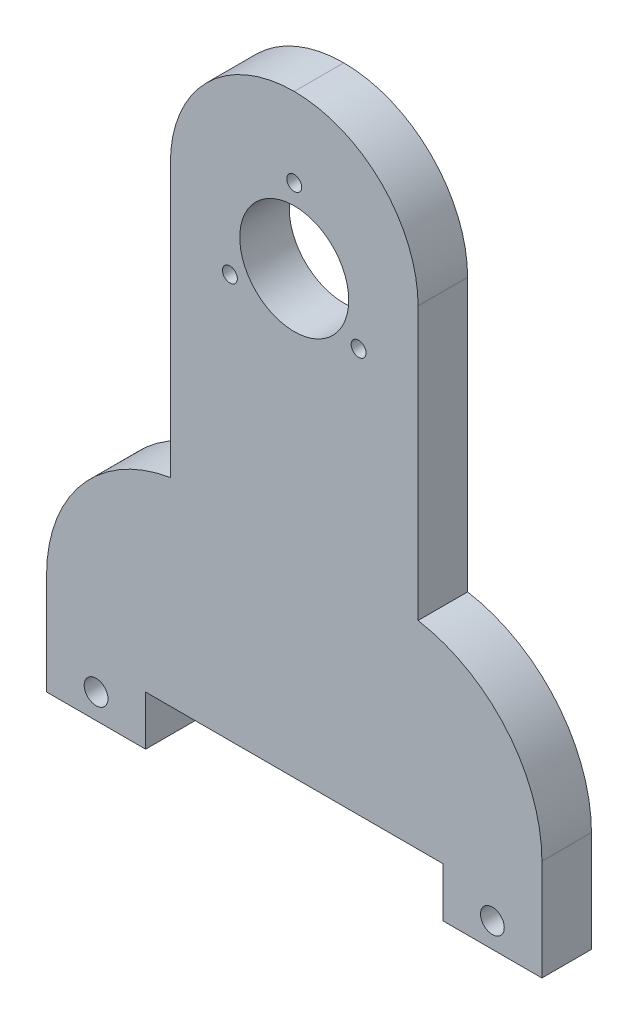
ISO-10303-21;
HEADER;
FILE_DESCRIPTION(('STEP AP214'),'2;1');
FILE_NAME('part.step','',(''),(''),'','','');
FILE_SCHEMA(('AUTOMOTIVE_DESIGN { 1 0 10303 214 1 1 1 1 }'));
ENDSEC;
DATA;
#1=APPLICATION_CONTEXT('core data for automotive mechanical design processes');
#2=APPLICATION_PROTOCOL_DEFINITION('international standard','automotive_design',2000,#1);
#3=PRODUCT_CONTEXT('',#1,'mechanical');
#4=PRODUCT('Part','Part','',(#3));
#5=PRODUCT_RELATED_PRODUCT_CATEGORY('part','',(#4));
#6=PRODUCT_DEFINITION_FORMATION('','',#4);
#7=PRODUCT_DEFINITION_CONTEXT('part definition',#1,'design');
#8=PRODUCT_DEFINITION('design','',#6,#7);
#9=PRODUCT_DEFINITION_SHAPE('','',#8);
#10=(LENGTH_UNIT() NAMED_UNIT(*) SI_UNIT(.MILLI.,.METRE.));
#11=(NAMED_UNIT(*) PLANE_ANGLE_UNIT() SI_UNIT($,.RADIAN.));
#12=(NAMED_UNIT(*) SI_UNIT($,.STERADIAN.) SOLID_ANGLE_UNIT());
#13=UNCERTAINTY_MEASURE_WITH_UNIT(LENGTH_MEASURE(1.E-05),#10,'distance_accuracy_value','');
#14=(GEOMETRIC_REPRESENTATION_CONTEXT(3) GLOBAL_UNCERTAINTY_ASSIGNED_CONTEXT((#13)) GLOBAL_UNIT_ASSIGNED_CONTEXT((#10,
#11,#12)) REPRESENTATION_CONTEXT('',''));
#15=CARTESIAN_POINT('',(0.,0.,0.));
#16=DIRECTION('',(0.,0.,1.));
#17=DIRECTION('',(1.,0.,0.));
#18=AXIS2_PLACEMENT_3D('',#15,#16,#17);
#19=CARTESIAN_POINT('',(30.,-49.,-15.));
#20=DIRECTION('',(0.,-1.,0.));
#21=DIRECTION('',(0.,0.,-1.));
#22=AXIS2_PLACEMENT_3D('',#19,#20,#21);
#23=PLANE('',#22);
#24=CARTESIAN_POINT('',(13.5,-49.,-7.5));
#25=DIRECTION('',(0.,1.,0.));
#26=DIRECTION('',(0.,0.,1.));
#27=AXIS2_PLACEMENT_3D('',#24,#25,#26);
#28=CIRCLE('',#27,2.);
#29=CARTESIAN_POINT('',(13.5,-49.,-5.5));
#30=VERTEX_POINT('',#29);
#31=EDGE_CURVE('E221',#30,#30,#28,.T.);
#32=ORIENTED_EDGE('',*,*,#31,.F.);
#33=EDGE_LOOP('',(#32));
#34=FACE_BOUND('',#33,.T.);
#35=DIRECTION('',(0.,0.,1.));
#36=VECTOR('',#35,1.);
#37=CARTESIAN_POINT('',(24.,-49.,-15.));
#38=LINE('',#37,#36);
#39=CARTESIAN_POINT('',(24.,-49.,-15.));
#40=VERTEX_POINT('',#39);
#41=CARTESIAN_POINT('',(24.,-49.,0.));
#42=VERTEX_POINT('',#41);
#43=EDGE_CURVE('E209',#40,#42,#38,.T.);
#44=ORIENTED_EDGE('',*,*,#43,.F.);
#45=DIRECTION('',(1.,0.,0.));
#46=VECTOR('',#45,1.);
#47=CARTESIAN_POINT('',(30.,-49.,-15.));
#48=LINE('',#47,#46);
#49=CARTESIAN_POINT('',(3.,-49.,-15.));
#50=VERTEX_POINT('',#49);
#51=EDGE_CURVE('E274',#50,#40,#48,.T.);
#52=ORIENTED_EDGE('',*,*,#51,.F.);
#53=DIRECTION('',(0.,0.,1.));
#54=VECTOR('',#53,1.);
#55=CARTESIAN_POINT('',(3.,-49.,-15.));
#56=LINE('',#55,#54);
#57=CARTESIAN_POINT('',(3.,-49.,0.));
#58=VERTEX_POINT('',#57);
#59=EDGE_CURVE('E253',#50,#58,#56,.T.);
#60=ORIENTED_EDGE('',*,*,#59,.T.);
#61=DIRECTION('',(1.,0.,0.));
#62=VECTOR('',#61,1.);
#63=CARTESIAN_POINT('',(30.,-49.,0.));
#64=LINE('',#63,#62);
#65=EDGE_CURVE('E282',#58,#42,#64,.T.);
#66=ORIENTED_EDGE('',*,*,#65,.T.);
#67=EDGE_LOOP('',(#44,#52,#60,#66));
#68=FACE_BOUND('',#67,.T.);
#69=ADVANCED_FACE('F37',(#34,#68),#23,.F.);
#70=CARTESIAN_POINT('',(-13.5,-49.,-7.5));
#71=DIRECTION('',(0.,1.,0.));
#72=DIRECTION('',(0.,0.,1.));
#73=AXIS2_PLACEMENT_3D('',#70,#71,#72);
#74=CIRCLE('',#73,2.);
#75=CARTESIAN_POINT('',(-13.5,-49.,-5.5));
#76=VERTEX_POINT('',#75);
#77=EDGE_CURVE('E370',#76,#76,#74,.T.);
#78=ORIENTED_EDGE('',*,*,#77,.F.);
#79=EDGE_LOOP('',(#78));
#80=FACE_BOUND('',#79,.T.);
#81=DIRECTION('',(0.,0.,-1.));
#82=VECTOR('',#81,1.);
#83=CARTESIAN_POINT('',(-24.,-49.,-15.));
#84=LINE('',#83,#82);
#85=CARTESIAN_POINT('',(-24.,-49.,0.));
#86=VERTEX_POINT('',#85);
#87=CARTESIAN_POINT('',(-24.,-49.,-15.));
#88=VERTEX_POINT('',#87);
#89=EDGE_CURVE('E235',#86,#88,#84,.T.);
#90=ORIENTED_EDGE('',*,*,#89,.F.);
#91=CARTESIAN_POINT('',(-3.,-49.,0.));
#92=VERTEX_POINT('',#91);
#93=EDGE_CURVE('E269',#86,#92,#64,.T.);
#94=ORIENTED_EDGE('',*,*,#93,.T.);
#95=DIRECTION('',(0.,0.,1.));
#96=VECTOR('',#95,1.);
#97=CARTESIAN_POINT('',(-3.,-49.,-15.));
#98=LINE('',#97,#96);
#99=CARTESIAN_POINT('',(-3.,-49.,-15.));
#100=VERTEX_POINT('',#99);
#101=EDGE_CURVE('E245',#100,#92,#98,.T.);
#102=ORIENTED_EDGE('',*,*,#101,.F.);
#103=EDGE_CURVE('E278',#88,#100,#48,.T.);
#104=ORIENTED_EDGE('',*,*,#103,.F.);
#105=EDGE_LOOP('',(#90,#94,#102,#104));
#106=FACE_BOUND('',#105,.T.);
#107=ADVANCED_FACE('F416',(#80,#106),#23,.F.);
#108=CARTESIAN_POINT('',(-50.,-65.,10.));
#109=DIRECTION('',(0.,1.,0.));
#110=DIRECTION('',(0.,0.,1.));
#111=AXIS2_PLACEMENT_3D('',#108,#109,#110);
#112=PLANE('',#111);
#113=DIRECTION('',(1.,0.,0.));
#114=VECTOR('',#113,1.);
#115=CARTESIAN_POINT('',(-50.,-65.,0.));
#116=LINE('',#115,#114);
#117=CARTESIAN_POINT('',(-50.,-65.,0.));
#118=VERTEX_POINT('',#117);
#119=CARTESIAN_POINT('',(-30.,-65.,0.));
#120=VERTEX_POINT('',#119);
#121=EDGE_CURVE('E319',#118,#120,#116,.T.);
#122=ORIENTED_EDGE('',*,*,#121,.T.);
#123=DIRECTION('',(0.,0.,1.));
#124=VECTOR('',#123,1.);
#125=CARTESIAN_POINT('',(-30.,-65.,-45.));
#126=LINE('',#125,#124);
#127=CARTESIAN_POINT('',(-30.,-65.,10.));
#128=VERTEX_POINT('',#127);
#129=EDGE_CURVE('E297',#120,#128,#126,.T.);
#130=ORIENTED_EDGE('',*,*,#129,.T.);
#131=DIRECTION('',(1.,0.,0.));
#132=VECTOR('',#131,1.);
#133=CARTESIAN_POINT('',(-50.,-65.,10.));
#134=LINE('',#133,#132);
#135=CARTESIAN_POINT('',(-50.,-65.,10.));
#136=VERTEX_POINT('',#135);
#137=EDGE_CURVE('E322',#136,#128,#134,.T.);
#138=ORIENTED_EDGE('',*,*,#137,.F.);
#139=DIRECTION('',(0.,0.,-1.));
#140=VECTOR('',#139,1.);
#141=CARTESIAN_POINT('',(-50.,-65.,10.));
#142=LINE('',#141,#140);
#143=EDGE_CURVE('E335',#136,#118,#142,.T.);
#144=ORIENTED_EDGE('',*,*,#143,.T.);
#145=EDGE_LOOP('',(#122,#130,#138,#144));
#146=FACE_BOUND('',#145,.T.);
#147=ADVANCED_FACE('F519',(#146),#112,.F.);
#148=CARTESIAN_POINT('',(50.,-65.,10.));
#149=DIRECTION('',(-1.,0.,0.));
#150=DIRECTION('',(0.,0.,1.));
#151=AXIS2_PLACEMENT_3D('',#148,#149,#150);
#152=PLANE('',#151);
#153=DIRECTION('',(0.,1.,0.));
#154=VECTOR('',#153,1.);
#155=CARTESIAN_POINT('',(50.,-65.,0.));
#156=LINE('',#155,#154);
#157=CARTESIAN_POINT('',(50.,-65.,0.));
#158=VERTEX_POINT('',#157);
#159=CARTESIAN_POINT('',(50.,-44.5803989154981,0.));
#160=VERTEX_POINT('',#159);
#161=EDGE_CURVE('E301',#158,#160,#156,.T.);
#162=ORIENTED_EDGE('',*,*,#161,.T.);
#163=DIRECTION('',(0.,0.,-1.));
#164=VECTOR('',#163,1.);
#165=CARTESIAN_POINT('',(50.,-44.5803989154981,10.));
#166=LINE('',#165,#164);
#167=CARTESIAN_POINT('',(50.,-44.5803989154981,10.));
#168=VERTEX_POINT('',#167);
#169=EDGE_CURVE('E347',#160,#168,#166,.F.);
#170=ORIENTED_EDGE('',*,*,#169,.T.);
#171=DIRECTION('',(0.,1.,0.));
#172=VECTOR('',#171,1.);
#173=CARTESIAN_POINT('',(50.,-65.,10.));
#174=LINE('',#173,#172);
#175=CARTESIAN_POINT('',(50.,-65.,10.));
#176=VERTEX_POINT('',#175);
#177=EDGE_CURVE('E315',#176,#168,#174,.T.);
#178=ORIENTED_EDGE('',*,*,#177,.F.);
#179=DIRECTION('',(0.,0.,-1.));
#180=VECTOR('',#179,1.);
#181=CARTESIAN_POINT('',(50.,-65.,10.));
#182=LINE('',#181,#180);
#183=EDGE_CURVE('E325',#176,#158,#182,.T.);
#184=ORIENTED_EDGE('',*,*,#183,.T.);
#185=EDGE_LOOP('',(#162,#170,#178,#184));
#186=FACE_BOUND('',#185,.T.);
#187=ADVANCED_FACE('F522',(#186),#152,.F.);
#188=CARTESIAN_POINT('',(-50.,-65.,10.));
#189=DIRECTION('',(1.,0.,0.));
#190=DIRECTION('',(0.,0.,-1.));
#191=AXIS2_PLACEMENT_3D('',#188,#189,#190);
#192=PLANE('',#191);
#193=DIRECTION('',(0.,-1.,0.));
#194=VECTOR('',#193,1.);
#195=CARTESIAN_POINT('',(-50.,-65.,10.));
#196=LINE('',#195,#194);
#197=CARTESIAN_POINT('',(-50.,-44.5803989154981,10.));
#198=VERTEX_POINT('',#197);
#199=EDGE_CURVE('E318',#198,#136,#196,.T.);
#200=ORIENTED_EDGE('',*,*,#199,.F.);
#201=DIRECTION('',(0.,0.,1.));
#202=VECTOR('',#201,1.);
#203=CARTESIAN_POINT('',(-50.,-44.5803989154981,10.));
#204=LINE('',#203,#202);
#205=CARTESIAN_POINT('',(-50.,-44.5803989154981,0.));
#206=VERTEX_POINT('',#205);
#207=EDGE_CURVE('E361',#198,#206,#204,.F.);
#208=ORIENTED_EDGE('',*,*,#207,.T.);
#209=DIRECTION('',(0.,-1.,0.));
#210=VECTOR('',#209,1.);
#211=CARTESIAN_POINT('',(-50.,-65.,0.));
#212=LINE('',#211,#210);
#213=EDGE_CURVE('E328',#206,#118,#212,.T.);
#214=ORIENTED_EDGE('',*,*,#213,.T.);
#215=ORIENTED_EDGE('',*,*,#143,.F.);
#216=EDGE_LOOP('',(#200,#208,#214,#215));
#217=FACE_BOUND('',#216,.T.);
#218=ADVANCED_FACE('F517',(#217),#192,.F.);
#219=CARTESIAN_POINT('',(30.,-65.,10.));
#220=VERTEX_POINT('',#219);
#221=EDGE_CURVE('E321',#220,#176,#134,.T.);
#222=ORIENTED_EDGE('',*,*,#221,.F.);
#223=DIRECTION('',(0.,0.,1.));
#224=VECTOR('',#223,1.);
#225=CARTESIAN_POINT('',(30.,-65.,-45.));
#226=LINE('',#225,#224);
#227=CARTESIAN_POINT('',(30.,-65.,0.));
#228=VERTEX_POINT('',#227);
#229=EDGE_CURVE('E304',#228,#220,#226,.T.);
#230=ORIENTED_EDGE('',*,*,#229,.F.);
#231=EDGE_CURVE('E330',#228,#158,#116,.T.);
#232=ORIENTED_EDGE('',*,*,#231,.T.);
#233=ORIENTED_EDGE('',*,*,#183,.F.);
#234=EDGE_LOOP('',(#222,#230,#232,#233));
#235=FACE_BOUND('',#234,.T.);
#236=ADVANCED_FACE('F510',(#235),#112,.F.);
#237=CARTESIAN_POINT('',(0.,0.,10.));
#238=DIRECTION('',(0.,0.,-1.));
#239=DIRECTION('',(-1.,0.,0.));
#240=AXIS2_PLACEMENT_3D('',#237,#238,#239);
#241=PLANE('',#240);
#242=CARTESIAN_POINT('',(0.,49.,10.));
#243=DIRECTION('',(0.,0.,1.));
#244=DIRECTION('',(1.,0.,0.));
#245=AXIS2_PLACEMENT_3D('',#242,#243,#244);
#246=CIRCLE('',#245,1.5);
#247=CARTESIAN_POINT('',(1.5,49.,10.));
#248=VERTEX_POINT('',#247);
#249=EDGE_CURVE('E391',#248,#248,#246,.T.);
#250=ORIENTED_EDGE('',*,*,#249,.F.);
#251=EDGE_LOOP('',(#250));
#252=FACE_BOUND('',#251,.T.);
#253=CARTESIAN_POINT('',(12.9903810567672,26.5000000000003,10.));
#254=DIRECTION('',(0.,0.,1.));
#255=DIRECTION('',(1.,0.,0.));
#256=AXIS2_PLACEMENT_3D('',#253,#254,#255);
#257=CIRCLE('',#256,1.5);
#258=CARTESIAN_POINT('',(14.4903810567672,26.5000000000003,10.));
#259=VERTEX_POINT('',#258);
#260=EDGE_CURVE('E871',#259,#259,#257,.T.);
#261=ORIENTED_EDGE('',*,*,#260,.F.);
#262=EDGE_LOOP('',(#261));
#263=FACE_BOUND('',#262,.T.);
#264=CARTESIAN_POINT('',(-12.990381056766,26.4999999999997,10.));
#265=DIRECTION('',(0.,0.,1.));
#266=DIRECTION('',(1.,0.,0.));
#267=AXIS2_PLACEMENT_3D('',#264,#265,#266);
#268=CIRCLE('',#267,1.5);
#269=CARTESIAN_POINT('',(-11.490381056766,26.4999999999997,10.));
#270=VERTEX_POINT('',#269);
#271=EDGE_CURVE('E403',#270,#270,#268,.T.);
#272=ORIENTED_EDGE('',*,*,#271,.F.);
#273=EDGE_LOOP('',(#272));
#274=FACE_BOUND('',#273,.T.);
#275=CARTESIAN_POINT('',(0.,34.,10.));
#276=DIRECTION('',(0.,0.,1.));
#277=DIRECTION('',(1.,0.,0.));
#278=AXIS2_PLACEMENT_3D('',#275,#276,#277);
#279=CIRCLE('',#278,11.);
#280=CARTESIAN_POINT('',(11.,34.,10.));
#281=VERTEX_POINT('',#280);
#282=EDGE_CURVE('E387',#281,#281,#279,.T.);
#283=ORIENTED_EDGE('',*,*,#282,.F.);
#284=EDGE_LOOP('',(#283));
#285=FACE_BOUND('',#284,.T.);
#286=DIRECTION('',(0.,-1.,0.));
#287=VECTOR('',#286,1.);
#288=CARTESIAN_POINT('',(25.,65.,10.));
#289=LINE('',#288,#287);
#290=CARTESIAN_POINT('',(25.,40.,10.));
#291=VERTEX_POINT('',#290);
#292=CARTESIAN_POINT('',(25.,-15.,10.));
#293=VERTEX_POINT('',#292);
#294=EDGE_CURVE('E310',#291,#293,#289,.T.);
#295=ORIENTED_EDGE('',*,*,#294,.F.);
#296=CARTESIAN_POINT('',(0.,40.,10.));
#297=DIRECTION('',(0.,0.,-1.));
#298=DIRECTION('',(-1.,0.,0.));
#299=AXIS2_PLACEMENT_3D('',#296,#297,#298);
#300=CIRCLE('',#299,25.);
#301=CARTESIAN_POINT('',(0.,65.,10.));
#302=VERTEX_POINT('',#301);
#303=EDGE_CURVE('E377',#291,#302,#300,.F.);
#304=ORIENTED_EDGE('',*,*,#303,.T.);
#305=CARTESIAN_POINT('',(0.,40.,10.));
#306=DIRECTION('',(0.,0.,-1.));
#307=DIRECTION('',(-1.,0.,0.));
#308=AXIS2_PLACEMENT_3D('',#305,#306,#307);
#309=CIRCLE('',#308,25.);
#310=CARTESIAN_POINT('',(-25.,40.,10.));
#311=VERTEX_POINT('',#310);
#312=EDGE_CURVE('E375',#302,#311,#309,.F.);
#313=ORIENTED_EDGE('',*,*,#312,.T.);
#314=DIRECTION('',(0.,1.,0.));
#315=VECTOR('',#314,1.);
#316=CARTESIAN_POINT('',(-25.,65.,10.));
#317=LINE('',#316,#315);
#318=CARTESIAN_POINT('',(-25.,-15.,10.));
#319=VERTEX_POINT('',#318);
#320=EDGE_CURVE('E292',#319,#311,#317,.T.);
#321=ORIENTED_EDGE('',*,*,#320,.F.);
#322=CARTESIAN_POINT('',(-20.,-44.5803989154981,10.));
#323=DIRECTION('',(0.,0.,-1.));
#324=DIRECTION('',(-1.,0.,0.));
#325=AXIS2_PLACEMENT_3D('',#322,#323,#324);
#326=CIRCLE('',#325,30.);
#327=EDGE_CURVE('E359',#319,#198,#326,.F.);
#328=ORIENTED_EDGE('',*,*,#327,.T.);
#329=ORIENTED_EDGE('',*,*,#199,.T.);
#330=ORIENTED_EDGE('',*,*,#137,.T.);
#331=DIRECTION('',(0.,-1.,0.));
#332=VECTOR('',#331,1.);
#333=CARTESIAN_POINT('',(-30.,-65.,10.));
#334=LINE('',#333,#332);
#335=CARTESIAN_POINT('',(-30.,-55.,10.));
#336=VERTEX_POINT('',#335);
#337=EDGE_CURVE('E289',#336,#128,#334,.T.);
#338=ORIENTED_EDGE('',*,*,#337,.F.);
#339=DIRECTION('',(-1.,0.,0.));
#340=VECTOR('',#339,1.);
#341=CARTESIAN_POINT('',(-30.,-55.,10.));
#342=LINE('',#341,#340);
#343=CARTESIAN_POINT('',(30.,-55.,10.));
#344=VERTEX_POINT('',#343);
#345=EDGE_CURVE('E295',#344,#336,#342,.T.);
#346=ORIENTED_EDGE('',*,*,#345,.F.);
#347=DIRECTION('',(0.,1.,0.));
#348=VECTOR('',#347,1.);
#349=CARTESIAN_POINT('',(30.,-65.,10.));
#350=LINE('',#349,#348);
#351=EDGE_CURVE('E291',#220,#344,#350,.T.);
#352=ORIENTED_EDGE('',*,*,#351,.F.);
#353=ORIENTED_EDGE('',*,*,#221,.T.);
#354=ORIENTED_EDGE('',*,*,#177,.T.);
#355=CARTESIAN_POINT('',(20.,-44.5803989154981,10.));
#356=DIRECTION('',(0.,0.,-1.));
#357=DIRECTION('',(-1.,0.,0.));
#358=AXIS2_PLACEMENT_3D('',#355,#356,#357);
#359=CIRCLE('',#358,30.);
#360=EDGE_CURVE('E354',#168,#293,#359,.F.);
#361=ORIENTED_EDGE('',*,*,#360,.T.);
#362=EDGE_LOOP('',(#295,#304,#313,#321,#328,#329,#330,#338,#346,#352,#353,#354,#361));
#363=FACE_BOUND('',#362,.T.);
#364=CARTESIAN_POINT('',(-40.,-60.,10.));
#365=DIRECTION('',(0.,0.,1.));
#366=DIRECTION('',(1.,0.,0.));
#367=AXIS2_PLACEMENT_3D('',#364,#365,#366);
#368=CIRCLE('',#367,2.4);
#369=CARTESIAN_POINT('',(-37.6,-60.,10.));
#370=VERTEX_POINT('',#369);
#371=EDGE_CURVE('E261',#370,#370,#368,.T.);
#372=ORIENTED_EDGE('',*,*,#371,.F.);
#373=EDGE_LOOP('',(#372));
#374=FACE_BOUND('',#373,.T.);
#375=CARTESIAN_POINT('',(40.,-60.,10.));
#376=DIRECTION('',(0.,0.,1.));
#377=DIRECTION('',(1.,0.,0.));
#378=AXIS2_PLACEMENT_3D('',#375,#376,#377);
#379=CIRCLE('',#378,2.4);
#380=CARTESIAN_POINT('',(42.4,-60.,10.));
#381=VERTEX_POINT('',#380);
#382=EDGE_CURVE('E260',#381,#381,#379,.T.);
#383=ORIENTED_EDGE('',*,*,#382,.F.);
#384=EDGE_LOOP('',(#383));
#385=FACE_BOUND('',#384,.T.);
#386=ADVANCED_FACE('F507',(#252,#263,#274,#285,#363,#374,#385),#241,.F.);
#387=CARTESIAN_POINT('',(0.,0.,0.));
#388=DIRECTION('',(0.,0.,-1.));
#389=DIRECTION('',(-1.,0.,0.));
#390=AXIS2_PLACEMENT_3D('',#387,#388,#389);
#391=PLANE('',#390);
#392=CARTESIAN_POINT('',(0.,49.,0.));
#393=DIRECTION('',(0.,0.,-1.));
#394=DIRECTION('',(-1.,0.,0.));
#395=AXIS2_PLACEMENT_3D('',#392,#393,#394);
#396=CIRCLE('',#395,1.5);
#397=CARTESIAN_POINT('',(-1.5,49.,0.));
#398=VERTEX_POINT('',#397);
#399=EDGE_CURVE('E41',#398,#398,#396,.T.);
#400=ORIENTED_EDGE('',*,*,#399,.F.);
#401=EDGE_LOOP('',(#400));
#402=FACE_BOUND('',#401,.T.);
#403=CARTESIAN_POINT('',(12.9903810567672,26.5000000000003,0.));
#404=DIRECTION('',(0.,0.,-1.));
#405=DIRECTION('',(-1.,0.,0.));
#406=AXIS2_PLACEMENT_3D('',#403,#404,#405);
#407=CIRCLE('',#406,1.5);
#408=CARTESIAN_POINT('',(11.4903810567672,26.5000000000003,0.));
#409=VERTEX_POINT('',#408);
#410=EDGE_CURVE('E390',#409,#409,#407,.T.);
#411=ORIENTED_EDGE('',*,*,#410,.F.);
#412=EDGE_LOOP('',(#411));
#413=FACE_BOUND('',#412,.T.);
#414=CARTESIAN_POINT('',(-12.990381056766,26.4999999999997,0.));
#415=DIRECTION('',(0.,0.,-1.));
#416=DIRECTION('',(-1.,0.,0.));
#417=AXIS2_PLACEMENT_3D('',#414,#415,#416);
#418=CIRCLE('',#417,1.5);
#419=CARTESIAN_POINT('',(-14.490381056766,26.4999999999997,0.));
#420=VERTEX_POINT('',#419);
#421=EDGE_CURVE('E388',#420,#420,#418,.T.);
#422=ORIENTED_EDGE('',*,*,#421,.F.);
#423=EDGE_LOOP('',(#422));
#424=FACE_BOUND('',#423,.T.);
#425=CARTESIAN_POINT('',(0.,34.,0.));
#426=DIRECTION('',(0.,0.,-1.));
#427=DIRECTION('',(-1.,0.,0.));
#428=AXIS2_PLACEMENT_3D('',#425,#426,#427);
#429=CIRCLE('',#428,11.);
#430=CARTESIAN_POINT('',(-11.,34.,0.));
#431=VERTEX_POINT('',#430);
#432=EDGE_CURVE('E384',#431,#431,#429,.T.);
#433=ORIENTED_EDGE('',*,*,#432,.F.);
#434=EDGE_LOOP('',(#433));
#435=FACE_BOUND('',#434,.T.);
#436=CARTESIAN_POINT('',(0.,40.,0.));
#437=DIRECTION('',(0.,0.,-1.));
#438=DIRECTION('',(-1.,0.,0.));
#439=AXIS2_PLACEMENT_3D('',#436,#437,#438);
#440=CIRCLE('',#439,25.);
#441=CARTESIAN_POINT('',(-25.,40.,0.));
#442=VERTEX_POINT('',#441);
#443=CARTESIAN_POINT('',(0.,65.,0.));
#444=VERTEX_POINT('',#443);
#445=EDGE_CURVE('E54',#442,#444,#440,.T.);
#446=ORIENTED_EDGE('',*,*,#445,.T.);
#447=CARTESIAN_POINT('',(0.,40.,0.));
#448=DIRECTION('',(0.,0.,-1.));
#449=DIRECTION('',(-1.,0.,0.));
#450=AXIS2_PLACEMENT_3D('',#447,#448,#449);
#451=CIRCLE('',#450,25.);
#452=CARTESIAN_POINT('',(25.,40.,0.));
#453=VERTEX_POINT('',#452);
#454=EDGE_CURVE('E46',#444,#453,#451,.T.);
#455=ORIENTED_EDGE('',*,*,#454,.T.);
#456=DIRECTION('',(0.,1.,0.));
#457=VECTOR('',#456,1.);
#458=CARTESIAN_POINT('',(25.,0.,0.));
#459=LINE('',#458,#457);
#460=CARTESIAN_POINT('',(25.,-15.,0.));
#461=VERTEX_POINT('',#460);
#462=EDGE_CURVE('E338',#461,#453,#459,.T.);
#463=ORIENTED_EDGE('',*,*,#462,.F.);
#464=CARTESIAN_POINT('',(20.,-44.5803989154981,0.));
#465=DIRECTION('',(0.,0.,-1.));
#466=DIRECTION('',(-1.,0.,0.));
#467=AXIS2_PLACEMENT_3D('',#464,#465,#466);
#468=CIRCLE('',#467,30.);
#469=EDGE_CURVE('E357',#461,#160,#468,.T.);
#470=ORIENTED_EDGE('',*,*,#469,.T.);
#471=ORIENTED_EDGE('',*,*,#161,.F.);
#472=ORIENTED_EDGE('',*,*,#231,.F.);
#473=DIRECTION('',(0.,-1.,0.));
#474=VECTOR('',#473,1.);
#475=CARTESIAN_POINT('',(30.,0.,0.));
#476=LINE('',#475,#474);
#477=CARTESIAN_POINT('',(30.,-55.,0.));
#478=VERTEX_POINT('',#477);
#479=EDGE_CURVE('E194',#478,#228,#476,.T.);
#480=ORIENTED_EDGE('',*,*,#479,.F.);
#481=DIRECTION('',(0.,-1.,0.));
#482=VECTOR('',#481,1.);
#483=CARTESIAN_POINT('',(30.,-55.,0.));
#484=LINE('',#483,#482);
#485=CARTESIAN_POINT('',(30.,-25.8796097382969,0.));
#486=VERTEX_POINT('',#485);
#487=EDGE_CURVE('E187',#486,#478,#484,.T.);
#488=ORIENTED_EDGE('',*,*,#487,.F.);
#489=DIRECTION('',(1.,0.,0.));
#490=VECTOR('',#489,1.);
#491=CARTESIAN_POINT('',(0.,-25.8796097382969,0.));
#492=LINE('',#491,#490);
#493=CARTESIAN_POINT('',(24.,-25.8796097382969,0.));
#494=VERTEX_POINT('',#493);
#495=EDGE_CURVE('E192',#494,#486,#492,.T.);
#496=ORIENTED_EDGE('',*,*,#495,.F.);
#497=DIRECTION('',(0.,-1.,0.));
#498=VECTOR('',#497,1.);
#499=CARTESIAN_POINT('',(24.,0.,0.));
#500=LINE('',#499,#498);
#501=EDGE_CURVE('E225',#494,#42,#500,.T.);
#502=ORIENTED_EDGE('',*,*,#501,.T.);
#503=ORIENTED_EDGE('',*,*,#65,.F.);
#504=DIRECTION('',(0.,-1.,0.));
#505=VECTOR('',#504,1.);
#506=CARTESIAN_POINT('',(3.,0.,0.));
#507=LINE('',#506,#505);
#508=CARTESIAN_POINT('',(3.,0.,0.));
#509=VERTEX_POINT('',#508);
#510=EDGE_CURVE('E256',#509,#58,#507,.T.);
#511=ORIENTED_EDGE('',*,*,#510,.F.);
#512=DIRECTION('',(1.,0.,0.));
#513=VECTOR('',#512,1.);
#514=CARTESIAN_POINT('',(0.,0.,0.));
#515=LINE('',#514,#513);
#516=CARTESIAN_POINT('',(-3.,0.,0.));
#517=VERTEX_POINT('',#516);
#518=EDGE_CURVE('E258',#517,#509,#515,.T.);
#519=ORIENTED_EDGE('',*,*,#518,.F.);
#520=DIRECTION('',(0.,-1.,0.));
#521=VECTOR('',#520,1.);
#522=CARTESIAN_POINT('',(-3.,0.,0.));
#523=LINE('',#522,#521);
#524=EDGE_CURVE('E250',#517,#92,#523,.T.);
#525=ORIENTED_EDGE('',*,*,#524,.T.);
#526=ORIENTED_EDGE('',*,*,#93,.F.);
#527=DIRECTION('',(0.,1.,0.));
#528=VECTOR('',#527,1.);
#529=CARTESIAN_POINT('',(-24.,0.,0.));
#530=LINE('',#529,#528);
#531=CARTESIAN_POINT('',(-24.,-25.8796097382969,0.));
#532=VERTEX_POINT('',#531);
#533=EDGE_CURVE('E238',#86,#532,#530,.T.);
#534=ORIENTED_EDGE('',*,*,#533,.T.);
#535=DIRECTION('',(-1.,0.,0.));
#536=VECTOR('',#535,1.);
#537=CARTESIAN_POINT('',(0.,-25.8796097382969,0.));
#538=LINE('',#537,#536);
#539=CARTESIAN_POINT('',(-30.,-25.8796097382969,0.));
#540=VERTEX_POINT('',#539);
#541=EDGE_CURVE('E231',#540,#532,#538,.F.);
#542=ORIENTED_EDGE('',*,*,#541,.F.);
#543=DIRECTION('',(0.,1.,0.));
#544=VECTOR('',#543,1.);
#545=CARTESIAN_POINT('',(-30.,-55.,0.));
#546=LINE('',#545,#544);
#547=CARTESIAN_POINT('',(-30.,-55.,0.));
#548=VERTEX_POINT('',#547);
#549=EDGE_CURVE('E199',#548,#540,#546,.T.);
#550=ORIENTED_EDGE('',*,*,#549,.F.);
#551=DIRECTION('',(0.,1.,0.));
#552=VECTOR('',#551,1.);
#553=CARTESIAN_POINT('',(-30.,0.,0.));
#554=LINE('',#553,#552);
#555=EDGE_CURVE('E344',#120,#548,#554,.T.);
#556=ORIENTED_EDGE('',*,*,#555,.F.);
#557=ORIENTED_EDGE('',*,*,#121,.F.);
#558=ORIENTED_EDGE('',*,*,#213,.F.);
#559=CARTESIAN_POINT('',(-20.,-44.5803989154981,0.));
#560=DIRECTION('',(0.,0.,-1.));
#561=DIRECTION('',(-1.,0.,0.));
#562=AXIS2_PLACEMENT_3D('',#559,#560,#561);
#563=CIRCLE('',#562,30.);
#564=CARTESIAN_POINT('',(-25.,-15.,0.));
#565=VERTEX_POINT('',#564);
#566=EDGE_CURVE('E363',#206,#565,#563,.T.);
#567=ORIENTED_EDGE('',*,*,#566,.T.);
#568=DIRECTION('',(0.,-1.,0.));
#569=VECTOR('',#568,1.);
#570=CARTESIAN_POINT('',(-25.,0.,0.));
#571=LINE('',#570,#569);
#572=EDGE_CURVE('E341',#442,#565,#571,.T.);
#573=ORIENTED_EDGE('',*,*,#572,.F.);
#574=EDGE_LOOP('',(#446,#455,#463,#470,#471,#472,#480,#488,#496,#502,#503,#511,#519,#525,#526,
#534,#542,#550,#556,#557,#558,#567,#573));
#575=FACE_BOUND('',#574,.T.);
#576=CARTESIAN_POINT('',(-40.,-60.,0.));
#577=DIRECTION('',(0.,0.,-1.));
#578=DIRECTION('',(-1.,0.,0.));
#579=AXIS2_PLACEMENT_3D('',#576,#577,#578);
#580=CIRCLE('',#579,2.4);
#581=CARTESIAN_POINT('',(-42.4,-60.,0.));
#582=VERTEX_POINT('',#581);
#583=EDGE_CURVE('E200',#582,#582,#580,.T.);
#584=ORIENTED_EDGE('',*,*,#583,.F.);
#585=EDGE_LOOP('',(#584));
#586=FACE_BOUND('',#585,.T.);
#587=CARTESIAN_POINT('',(40.,-60.,0.));
#588=DIRECTION('',(0.,0.,-1.));
#589=DIRECTION('',(-1.,0.,0.));
#590=AXIS2_PLACEMENT_3D('',#587,#588,#589);
#591=CIRCLE('',#590,2.4);
#592=CARTESIAN_POINT('',(37.6,-60.,0.));
#593=VERTEX_POINT('',#592);
#594=EDGE_CURVE('E264',#593,#593,#591,.T.);
#595=ORIENTED_EDGE('',*,*,#594,.F.);
#596=EDGE_LOOP('',(#595));
#597=FACE_BOUND('',#596,.T.);
#598=ADVANCED_FACE('F189',(#402,#413,#424,#435,#575,#586,#597),#391,.T.);
#599=CARTESIAN_POINT('',(25.,65.,-45.));
#600=DIRECTION('',(-1.,0.,0.));
#601=DIRECTION('',(0.,-1.,0.));
#602=AXIS2_PLACEMENT_3D('',#599,#600,#601);
#603=PLANE('',#602);
#604=ORIENTED_EDGE('',*,*,#462,.T.);
#605=DIRECTION('',(0.,0.,1.));
#606=VECTOR('',#605,1.);
#607=CARTESIAN_POINT('',(25.,40.,-45.));
#608=LINE('',#607,#606);
#609=EDGE_CURVE('E366',#453,#291,#608,.T.);
#610=ORIENTED_EDGE('',*,*,#609,.T.);
#611=ORIENTED_EDGE('',*,*,#294,.T.);
#612=DIRECTION('',(0.,0.,1.));
#613=VECTOR('',#612,1.);
#614=CARTESIAN_POINT('',(25.,-15.,-45.));
#615=LINE('',#614,#613);
#616=EDGE_CURVE('E288',#461,#293,#615,.T.);
#617=ORIENTED_EDGE('',*,*,#616,.F.);
#618=EDGE_LOOP('',(#604,#610,#611,#617));
#619=FACE_BOUND('',#618,.T.);
#620=ADVANCED_FACE('F503',(#619),#603,.F.);
#621=CARTESIAN_POINT('',(-25.,65.,-45.));
#622=DIRECTION('',(1.,0.,0.));
#623=DIRECTION('',(0.,1.,0.));
#624=AXIS2_PLACEMENT_3D('',#621,#622,#623);
#625=PLANE('',#624);
#626=ORIENTED_EDGE('',*,*,#320,.T.);
#627=DIRECTION('',(0.,0.,1.));
#628=VECTOR('',#627,1.);
#629=CARTESIAN_POINT('',(-25.,40.,-45.));
#630=LINE('',#629,#628);
#631=EDGE_CURVE('E11',#311,#442,#630,.F.);
#632=ORIENTED_EDGE('',*,*,#631,.T.);
#633=ORIENTED_EDGE('',*,*,#572,.T.);
#634=DIRECTION('',(0.,0.,1.));
#635=VECTOR('',#634,1.);
#636=CARTESIAN_POINT('',(-25.,-15.,-45.));
#637=LINE('',#636,#635);
#638=EDGE_CURVE('E308',#565,#319,#637,.T.);
#639=ORIENTED_EDGE('',*,*,#638,.T.);
#640=EDGE_LOOP('',(#626,#632,#633,#639));
#641=FACE_BOUND('',#640,.T.);
#642=ADVANCED_FACE('F499',(#641),#625,.F.);
#643=CARTESIAN_POINT('',(-30.,-65.,-45.));
#644=DIRECTION('',(-1.,0.,0.));
#645=DIRECTION('',(0.,0.,1.));
#646=AXIS2_PLACEMENT_3D('',#643,#644,#645);
#647=PLANE('',#646);
#648=ORIENTED_EDGE('',*,*,#555,.T.);
#649=DIRECTION('',(0.,0.,1.));
#650=VECTOR('',#649,1.);
#651=CARTESIAN_POINT('',(-30.,-55.,-45.));
#652=LINE('',#651,#650);
#653=EDGE_CURVE('E298',#548,#336,#652,.T.);
#654=ORIENTED_EDGE('',*,*,#653,.T.);
#655=ORIENTED_EDGE('',*,*,#337,.T.);
#656=ORIENTED_EDGE('',*,*,#129,.F.);
#657=EDGE_LOOP('',(#648,#654,#655,#656));
#658=FACE_BOUND('',#657,.T.);
#659=ADVANCED_FACE('F492',(#658),#647,.F.);
#660=CARTESIAN_POINT('',(-30.,-55.,-45.));
#661=DIRECTION('',(0.,1.,0.));
#662=DIRECTION('',(0.,0.,1.));
#663=AXIS2_PLACEMENT_3D('',#660,#661,#662);
#664=PLANE('',#663);
#665=CARTESIAN_POINT('',(-13.5,-55.,-7.5));
#666=DIRECTION('',(0.,1.,0.));
#667=DIRECTION('',(0.,0.,1.));
#668=AXIS2_PLACEMENT_3D('',#665,#666,#667);
#669=CIRCLE('',#668,2.);
#670=CARTESIAN_POINT('',(-13.5,-55.,-5.5));
#671=VERTEX_POINT('',#670);
#672=EDGE_CURVE('E218',#671,#671,#669,.T.);
#673=ORIENTED_EDGE('',*,*,#672,.T.);
#674=EDGE_LOOP('',(#673));
#675=FACE_BOUND('',#674,.T.);
#676=CARTESIAN_POINT('',(13.5,-55.,-7.5));
#677=DIRECTION('',(0.,1.,0.));
#678=DIRECTION('',(0.,0.,1.));
#679=AXIS2_PLACEMENT_3D('',#676,#677,#678);
#680=CIRCLE('',#679,2.);
#681=CARTESIAN_POINT('',(13.5,-55.,-5.5));
#682=VERTEX_POINT('',#681);
#683=EDGE_CURVE('E367',#682,#682,#680,.T.);
#684=ORIENTED_EDGE('',*,*,#683,.T.);
#685=EDGE_LOOP('',(#684));
#686=FACE_BOUND('',#685,.T.);
#687=ORIENTED_EDGE('',*,*,#345,.T.);
#688=ORIENTED_EDGE('',*,*,#653,.F.);
#689=DIRECTION('',(0.,0.,1.));
#690=VECTOR('',#689,1.);
#691=CARTESIAN_POINT('',(-30.,-55.,-15.));
#692=LINE('',#691,#690);
#693=CARTESIAN_POINT('',(-30.,-55.,-15.));
#694=VERTEX_POINT('',#693);
#695=EDGE_CURVE('E277',#694,#548,#692,.T.);
#696=ORIENTED_EDGE('',*,*,#695,.F.);
#697=DIRECTION('',(-1.,0.,0.));
#698=VECTOR('',#697,1.);
#699=CARTESIAN_POINT('',(30.,-55.,-15.));
#700=LINE('',#699,#698);
#701=CARTESIAN_POINT('',(30.,-55.,-15.));
#702=VERTEX_POINT('',#701);
#703=EDGE_CURVE('E268',#702,#694,#700,.T.);
#704=ORIENTED_EDGE('',*,*,#703,.F.);
#705=DIRECTION('',(0.,0.,1.));
#706=VECTOR('',#705,1.);
#707=CARTESIAN_POINT('',(30.,-55.,-15.));
#708=LINE('',#707,#706);
#709=EDGE_CURVE('E286',#702,#478,#708,.T.);
#710=ORIENTED_EDGE('',*,*,#709,.T.);
#711=DIRECTION('',(0.,0.,1.));
#712=VECTOR('',#711,1.);
#713=CARTESIAN_POINT('',(30.,-55.,-45.));
#714=LINE('',#713,#712);
#715=EDGE_CURVE('E302',#478,#344,#714,.T.);
#716=ORIENTED_EDGE('',*,*,#715,.T.);
#717=EDGE_LOOP('',(#687,#688,#696,#704,#710,#716));
#718=FACE_BOUND('',#717,.T.);
#719=ADVANCED_FACE('F489',(#675,#686,#718),#664,.F.);
#720=CARTESIAN_POINT('',(30.,-65.,-45.));
#721=DIRECTION('',(1.,0.,0.));
#722=DIRECTION('',(0.,0.,-1.));
#723=AXIS2_PLACEMENT_3D('',#720,#721,#722);
#724=PLANE('',#723);
#725=ORIENTED_EDGE('',*,*,#479,.T.);
#726=ORIENTED_EDGE('',*,*,#229,.T.);
#727=ORIENTED_EDGE('',*,*,#351,.T.);
#728=ORIENTED_EDGE('',*,*,#715,.F.);
#729=EDGE_LOOP('',(#725,#726,#727,#728));
#730=FACE_BOUND('',#729,.T.);
#731=ADVANCED_FACE('F488',(#730),#724,.F.);
#732=CARTESIAN_POINT('',(30.,-55.,-15.));
#733=DIRECTION('',(-1.,0.,0.));
#734=DIRECTION('',(0.,0.,1.));
#735=AXIS2_PLACEMENT_3D('',#732,#733,#734);
#736=PLANE('',#735);
#737=ORIENTED_EDGE('',*,*,#487,.T.);
#738=ORIENTED_EDGE('',*,*,#709,.F.);
#739=DIRECTION('',(0.,-1.,0.));
#740=VECTOR('',#739,1.);
#741=CARTESIAN_POINT('',(30.,-55.,-15.));
#742=LINE('',#741,#740);
#743=CARTESIAN_POINT('',(30.,-49.,-15.));
#744=VERTEX_POINT('',#743);
#745=EDGE_CURVE('E215',#744,#702,#742,.T.);
#746=ORIENTED_EDGE('',*,*,#745,.F.);
#747=DIRECTION('',(0.,0.838911749909776,0.544267467210119));
#748=VECTOR('',#747,1.);
#749=CARTESIAN_POINT('',(30.,-49.,-15.));
#750=LINE('',#749,#748);
#751=EDGE_CURVE('E205',#744,#486,#750,.T.);
#752=ORIENTED_EDGE('',*,*,#751,.T.);
#753=EDGE_LOOP('',(#737,#738,#746,#752));
#754=FACE_BOUND('',#753,.T.);
#755=ADVANCED_FACE('F213',(#754),#736,.F.);
#756=CARTESIAN_POINT('',(-30.,-55.,-15.));
#757=DIRECTION('',(1.,0.,0.));
#758=DIRECTION('',(0.,0.,-1.));
#759=AXIS2_PLACEMENT_3D('',#756,#757,#758);
#760=PLANE('',#759);
#761=ORIENTED_EDGE('',*,*,#549,.T.);
#762=DIRECTION('',(0.,0.838911749909776,0.544267467210119));
#763=VECTOR('',#762,1.);
#764=CARTESIAN_POINT('',(-30.,-49.,-15.));
#765=LINE('',#764,#763);
#766=CARTESIAN_POINT('',(-30.,-49.,-15.));
#767=VERTEX_POINT('',#766);
#768=EDGE_CURVE('E228',#767,#540,#765,.T.);
#769=ORIENTED_EDGE('',*,*,#768,.F.);
#770=DIRECTION('',(0.,1.,0.));
#771=VECTOR('',#770,1.);
#772=CARTESIAN_POINT('',(-30.,-55.,-15.));
#773=LINE('',#772,#771);
#774=EDGE_CURVE('E271',#694,#767,#773,.T.);
#775=ORIENTED_EDGE('',*,*,#774,.F.);
#776=ORIENTED_EDGE('',*,*,#695,.T.);
#777=EDGE_LOOP('',(#761,#769,#775,#776));
#778=FACE_BOUND('',#777,.T.);
#779=ADVANCED_FACE('F481',(#778),#760,.F.);
#780=CARTESIAN_POINT('',(0.,0.,-15.));
#781=DIRECTION('',(0.,0.,1.));
#782=DIRECTION('',(1.,0.,0.));
#783=AXIS2_PLACEMENT_3D('',#780,#781,#782);
#784=PLANE('',#783);
#785=ORIENTED_EDGE('',*,*,#703,.T.);
#786=ORIENTED_EDGE('',*,*,#774,.T.);
#787=EDGE_CURVE('E275',#767,#88,#48,.T.);
#788=ORIENTED_EDGE('',*,*,#787,.T.);
#789=ORIENTED_EDGE('',*,*,#103,.T.);
#790=EDGE_CURVE('E279',#100,#50,#48,.T.);
#791=ORIENTED_EDGE('',*,*,#790,.T.);
#792=ORIENTED_EDGE('',*,*,#51,.T.);
#793=DIRECTION('',(-1.,0.,0.));
#794=VECTOR('',#793,1.);
#795=CARTESIAN_POINT('',(0.,-49.,-15.));
#796=LINE('',#795,#794);
#797=EDGE_CURVE('E210',#744,#40,#796,.T.);
#798=ORIENTED_EDGE('',*,*,#797,.F.);
#799=ORIENTED_EDGE('',*,*,#745,.T.);
#800=EDGE_LOOP('',(#785,#786,#788,#789,#791,#792,#798,#799));
#801=FACE_BOUND('',#800,.T.);
#802=ADVANCED_FACE('F426',(#801),#784,.F.);
#803=CARTESIAN_POINT('',(40.,-60.,-5.));
#804=DIRECTION('',(0.,0.,1.));
#805=DIRECTION('',(1.,0.,0.));
#806=AXIS2_PLACEMENT_3D('',#803,#804,#805);
#807=CYLINDRICAL_SURFACE('',#806,2.4);
#808=ORIENTED_EDGE('',*,*,#594,.T.);
#809=EDGE_LOOP('',(#808));
#810=FACE_BOUND('',#809,.T.);
#811=ORIENTED_EDGE('',*,*,#382,.T.);
#812=EDGE_LOOP('',(#811));
#813=FACE_BOUND('',#812,.T.);
#814=ADVANCED_FACE('F475',(#810,#813),#807,.F.);
#815=CARTESIAN_POINT('',(-40.,-60.,-5.));
#816=DIRECTION('',(0.,0.,1.));
#817=DIRECTION('',(1.,0.,0.));
#818=AXIS2_PLACEMENT_3D('',#815,#816,#817);
#819=CYLINDRICAL_SURFACE('',#818,2.4);
#820=ORIENTED_EDGE('',*,*,#583,.T.);
#821=EDGE_LOOP('',(#820));
#822=FACE_BOUND('',#821,.T.);
#823=ORIENTED_EDGE('',*,*,#371,.T.);
#824=EDGE_LOOP('',(#823));
#825=FACE_BOUND('',#824,.T.);
#826=ADVANCED_FACE('F471',(#822,#825),#819,.F.);
#827=CARTESIAN_POINT('',(20.,-44.5803989154981,-45.));
#828=DIRECTION('',(0.,0.,-1.));
#829=DIRECTION('',(-1.,0.,0.));
#830=AXIS2_PLACEMENT_3D('',#827,#828,#829);
#831=CYLINDRICAL_SURFACE('',#830,30.);
#832=ORIENTED_EDGE('',*,*,#616,.T.);
#833=ORIENTED_EDGE('',*,*,#360,.F.);
#834=ORIENTED_EDGE('',*,*,#169,.F.);
#835=ORIENTED_EDGE('',*,*,#469,.F.);
#836=EDGE_LOOP('',(#832,#833,#834,#835));
#837=FACE_BOUND('',#836,.T.);
#838=ADVANCED_FACE('F474',(#837),#831,.T.);
#839=CARTESIAN_POINT('',(-20.,-44.5803989154981,-45.));
#840=DIRECTION('',(0.,0.,1.));
#841=DIRECTION('',(1.,0.,0.));
#842=AXIS2_PLACEMENT_3D('',#839,#840,#841);
#843=CYLINDRICAL_SURFACE('',#842,30.);
#844=ORIENTED_EDGE('',*,*,#327,.F.);
#845=ORIENTED_EDGE('',*,*,#638,.F.);
#846=ORIENTED_EDGE('',*,*,#566,.F.);
#847=ORIENTED_EDGE('',*,*,#207,.F.);
#848=EDGE_LOOP('',(#844,#845,#846,#847));
#849=FACE_BOUND('',#848,.T.);
#850=ADVANCED_FACE('F470',(#849),#843,.T.);
#851=CARTESIAN_POINT('',(0.,-49.,-15.));
#852=DIRECTION('',(0.,0.292714272094112,-0.956199955507432));
#853=DIRECTION('',(0.,0.956199955507432,0.292714272094112));
#854=AXIS2_PLACEMENT_3D('',#851,#852,#853);
#855=PLANE('',#854);
#856=DIRECTION('',(0.,0.956199955507432,0.292714272094112));
#857=VECTOR('',#856,1.);
#858=CARTESIAN_POINT('',(-3.,-49.,-15.));
#859=LINE('',#858,#857);
#860=EDGE_CURVE('E241',#100,#517,#859,.T.);
#861=ORIENTED_EDGE('',*,*,#860,.T.);
#862=ORIENTED_EDGE('',*,*,#518,.T.);
#863=DIRECTION('',(0.,0.956199955507432,0.292714272094112));
#864=VECTOR('',#863,1.);
#865=CARTESIAN_POINT('',(3.,-49.,-15.));
#866=LINE('',#865,#864);
#867=EDGE_CURVE('E242',#50,#509,#866,.T.);
#868=ORIENTED_EDGE('',*,*,#867,.F.);
#869=ORIENTED_EDGE('',*,*,#790,.F.);
#870=EDGE_LOOP('',(#861,#862,#868,#869));
#871=FACE_BOUND('',#870,.T.);
#872=ADVANCED_FACE('F434',(#871),#855,.T.);
#873=CARTESIAN_POINT('',(3.,0.,-2.5));
#874=DIRECTION('',(1.,0.,0.));
#875=DIRECTION('',(0.,0.,-1.));
#876=AXIS2_PLACEMENT_3D('',#873,#874,#875);
#877=PLANE('',#876);
#878=ORIENTED_EDGE('',*,*,#867,.T.);
#879=ORIENTED_EDGE('',*,*,#510,.T.);
#880=ORIENTED_EDGE('',*,*,#59,.F.);
#881=EDGE_LOOP('',(#878,#879,#880));
#882=FACE_BOUND('',#881,.T.);
#883=ADVANCED_FACE('F443',(#882),#877,.T.);
#884=CARTESIAN_POINT('',(-3.,0.,-2.5));
#885=DIRECTION('',(1.,0.,0.));
#886=DIRECTION('',(0.,0.,-1.));
#887=AXIS2_PLACEMENT_3D('',#884,#885,#886);
#888=PLANE('',#887);
#889=ORIENTED_EDGE('',*,*,#524,.F.);
#890=ORIENTED_EDGE('',*,*,#860,.F.);
#891=ORIENTED_EDGE('',*,*,#101,.T.);
#892=EDGE_LOOP('',(#889,#890,#891));
#893=FACE_BOUND('',#892,.T.);
#894=ADVANCED_FACE('F438',(#893),#888,.F.);
#895=CARTESIAN_POINT('',(-30.,-49.,-15.));
#896=DIRECTION('',(0.,-0.544267467210119,0.838911749909776));
#897=DIRECTION('',(0.,0.838911749909776,0.544267467210119));
#898=AXIS2_PLACEMENT_3D('',#895,#896,#897);
#899=PLANE('',#898);
#900=ORIENTED_EDGE('',*,*,#768,.T.);
#901=ORIENTED_EDGE('',*,*,#541,.T.);
#902=DIRECTION('',(0.,0.838911749909776,0.544267467210119));
#903=VECTOR('',#902,1.);
#904=CARTESIAN_POINT('',(-24.,-49.,-15.));
#905=LINE('',#904,#903);
#906=EDGE_CURVE('E227',#88,#532,#905,.T.);
#907=ORIENTED_EDGE('',*,*,#906,.F.);
#908=ORIENTED_EDGE('',*,*,#787,.F.);
#909=EDGE_LOOP('',(#900,#901,#907,#908));
#910=FACE_BOUND('',#909,.T.);
#911=ADVANCED_FACE('F459',(#910),#899,.F.);
#912=CARTESIAN_POINT('',(-24.,0.,-2.5));
#913=DIRECTION('',(-1.,0.,0.));
#914=DIRECTION('',(0.,0.,1.));
#915=AXIS2_PLACEMENT_3D('',#912,#913,#914);
#916=PLANE('',#915);
#917=ORIENTED_EDGE('',*,*,#533,.F.);
#918=ORIENTED_EDGE('',*,*,#89,.T.);
#919=ORIENTED_EDGE('',*,*,#906,.T.);
#920=EDGE_LOOP('',(#917,#918,#919));
#921=FACE_BOUND('',#920,.T.);
#922=ADVANCED_FACE('F453',(#921),#916,.F.);
#923=CARTESIAN_POINT('',(30.,-49.,-15.));
#924=DIRECTION('',(0.,0.544267467210119,-0.838911749909776));
#925=DIRECTION('',(0.,0.838911749909776,0.544267467210119));
#926=AXIS2_PLACEMENT_3D('',#923,#924,#925);
#927=PLANE('',#926);
#928=DIRECTION('',(0.,0.838911749909776,0.544267467210119));
#929=VECTOR('',#928,1.);
#930=CARTESIAN_POINT('',(24.,-49.,-15.));
#931=LINE('',#930,#929);
#932=EDGE_CURVE('E208',#40,#494,#931,.T.);
#933=ORIENTED_EDGE('',*,*,#932,.T.);
#934=ORIENTED_EDGE('',*,*,#495,.T.);
#935=ORIENTED_EDGE('',*,*,#751,.F.);
#936=ORIENTED_EDGE('',*,*,#797,.T.);
#937=EDGE_LOOP('',(#933,#934,#935,#936));
#938=FACE_BOUND('',#937,.T.);
#939=ADVANCED_FACE('F204',(#938),#927,.T.);
#940=CARTESIAN_POINT('',(24.,0.,-2.5));
#941=DIRECTION('',(1.,0.,0.));
#942=DIRECTION('',(0.,0.,-1.));
#943=AXIS2_PLACEMENT_3D('',#940,#941,#942);
#944=PLANE('',#943);
#945=ORIENTED_EDGE('',*,*,#501,.F.);
#946=ORIENTED_EDGE('',*,*,#932,.F.);
#947=ORIENTED_EDGE('',*,*,#43,.T.);
#948=EDGE_LOOP('',(#945,#946,#947));
#949=FACE_BOUND('',#948,.T.);
#950=ADVANCED_FACE('F444',(#949),#944,.F.);
#951=CARTESIAN_POINT('',(13.5,-64.,-7.5));
#952=DIRECTION('',(0.,1.,0.));
#953=DIRECTION('',(0.,0.,1.));
#954=AXIS2_PLACEMENT_3D('',#951,#952,#953);
#955=CYLINDRICAL_SURFACE('',#954,2.);
#956=ORIENTED_EDGE('',*,*,#31,.T.);
#957=EDGE_LOOP('',(#956));
#958=FACE_BOUND('',#957,.T.);
#959=ORIENTED_EDGE('',*,*,#683,.F.);
#960=EDGE_LOOP('',(#959));
#961=FACE_BOUND('',#960,.T.);
#962=ADVANCED_FACE('F411',(#958,#961),#955,.F.);
#963=CARTESIAN_POINT('',(-13.5,-64.,-7.5));
#964=DIRECTION('',(0.,1.,0.));
#965=DIRECTION('',(0.,0.,1.));
#966=AXIS2_PLACEMENT_3D('',#963,#964,#965);
#967=CYLINDRICAL_SURFACE('',#966,2.);
#968=ORIENTED_EDGE('',*,*,#77,.T.);
#969=EDGE_LOOP('',(#968));
#970=FACE_BOUND('',#969,.T.);
#971=ORIENTED_EDGE('',*,*,#672,.F.);
#972=EDGE_LOOP('',(#971));
#973=FACE_BOUND('',#972,.T.);
#974=ADVANCED_FACE('F451',(#970,#973),#967,.F.);
#975=CARTESIAN_POINT('',(0.,40.,10.));
#976=DIRECTION('',(0.,0.,1.));
#977=DIRECTION('',(1.,0.,0.));
#978=AXIS2_PLACEMENT_3D('',#975,#976,#977);
#979=CYLINDRICAL_SURFACE('',#978,25.);
#980=DIRECTION('',(0.,0.,1.));
#981=VECTOR('',#980,1.);
#982=CARTESIAN_POINT('',(0.,65.,10.));
#983=LINE('',#982,#981);
#984=EDGE_CURVE('E381',#444,#302,#983,.T.);
#985=ORIENTED_EDGE('',*,*,#984,.F.);
#986=ORIENTED_EDGE('',*,*,#445,.F.);
#987=ORIENTED_EDGE('',*,*,#631,.F.);
#988=ORIENTED_EDGE('',*,*,#312,.F.);
#989=EDGE_LOOP('',(#985,#986,#987,#988));
#990=FACE_BOUND('',#989,.T.);
#991=ADVANCED_FACE('F39',(#990),#979,.T.);
#992=CARTESIAN_POINT('',(0.,40.,-45.));
#993=DIRECTION('',(0.,0.,1.));
#994=DIRECTION('',(1.,0.,0.));
#995=AXIS2_PLACEMENT_3D('',#992,#993,#994);
#996=CYLINDRICAL_SURFACE('',#995,25.);
#997=ORIENTED_EDGE('',*,*,#454,.F.);
#998=ORIENTED_EDGE('',*,*,#984,.T.);
#999=ORIENTED_EDGE('',*,*,#303,.F.);
#1000=ORIENTED_EDGE('',*,*,#609,.F.);
#1001=EDGE_LOOP('',(#997,#998,#999,#1000));
#1002=FACE_BOUND('',#1001,.T.);
#1003=ADVANCED_FACE('F532',(#1002),#996,.T.);
#1004=CARTESIAN_POINT('',(0.,34.,-5.));
#1005=DIRECTION('',(0.,0.,1.));
#1006=DIRECTION('',(1.,0.,0.));
#1007=AXIS2_PLACEMENT_3D('',#1004,#1005,#1006);
#1008=CYLINDRICAL_SURFACE('',#1007,11.);
#1009=ORIENTED_EDGE('',*,*,#432,.T.);
#1010=EDGE_LOOP('',(#1009));
#1011=FACE_BOUND('',#1010,.T.);
#1012=ORIENTED_EDGE('',*,*,#282,.T.);
#1013=EDGE_LOOP('',(#1012));
#1014=FACE_BOUND('',#1013,.T.);
#1015=ADVANCED_FACE('F534',(#1011,#1014),#1008,.F.);
#1016=CARTESIAN_POINT('',(-12.990381056766,26.4999999999997,-5.));
#1017=DIRECTION('',(0.,0.,1.));
#1018=DIRECTION('',(1.,0.,0.));
#1019=AXIS2_PLACEMENT_3D('',#1016,#1017,#1018);
#1020=CYLINDRICAL_SURFACE('',#1019,1.5);
#1021=ORIENTED_EDGE('',*,*,#421,.T.);
#1022=EDGE_LOOP('',(#1021));
#1023=FACE_BOUND('',#1022,.T.);
#1024=ORIENTED_EDGE('',*,*,#271,.T.);
#1025=EDGE_LOOP('',(#1024));
#1026=FACE_BOUND('',#1025,.T.);
#1027=ADVANCED_FACE('F540',(#1023,#1026),#1020,.F.);
#1028=CARTESIAN_POINT('',(12.9903810567672,26.5000000000003,-5.));
#1029=DIRECTION('',(0.,0.,1.));
#1030=DIRECTION('',(1.,0.,0.));
#1031=AXIS2_PLACEMENT_3D('',#1028,#1029,#1030);
#1032=CYLINDRICAL_SURFACE('',#1031,1.5);
#1033=ORIENTED_EDGE('',*,*,#410,.T.);
#1034=EDGE_LOOP('',(#1033));
#1035=FACE_BOUND('',#1034,.T.);
#1036=ORIENTED_EDGE('',*,*,#260,.T.);
#1037=EDGE_LOOP('',(#1036));
#1038=FACE_BOUND('',#1037,.T.);
#1039=ADVANCED_FACE('F833',(#1035,#1038),#1032,.F.);
#1040=CARTESIAN_POINT('',(0.,49.,-5.));
#1041=DIRECTION('',(0.,0.,1.));
#1042=DIRECTION('',(1.,0.,0.));
#1043=AXIS2_PLACEMENT_3D('',#1040,#1041,#1042);
#1044=CYLINDRICAL_SURFACE('',#1043,1.5);
#1045=ORIENTED_EDGE('',*,*,#399,.T.);
#1046=EDGE_LOOP('',(#1045));
#1047=FACE_BOUND('',#1046,.T.);
#1048=ORIENTED_EDGE('',*,*,#249,.T.);
#1049=EDGE_LOOP('',(#1048));
#1050=FACE_BOUND('',#1049,.T.);
#1051=ADVANCED_FACE('F844',(#1047,#1050),#1044,.F.);
#1052=CLOSED_SHELL('',(#69,#107,#147,#187,#218,#236,#386,#598,#620,#642,#659,#719,#731,#755,
#779,#802,#814,#826,#838,#850,#872,#883,#894,#911,#922,#939,#950,#962,#974,#991,#1003,#1015,
#1027,#1039,#1051));
#1053=MANIFOLD_SOLID_BREP('B2',#1052);
#1054=ADVANCED_BREP_SHAPE_REPRESENTATION('',(#18,#1053),#14);
#1055=SHAPE_DEFINITION_REPRESENTATION(#9,#1054);
ENDSEC;
END-ISO-10303-21;
